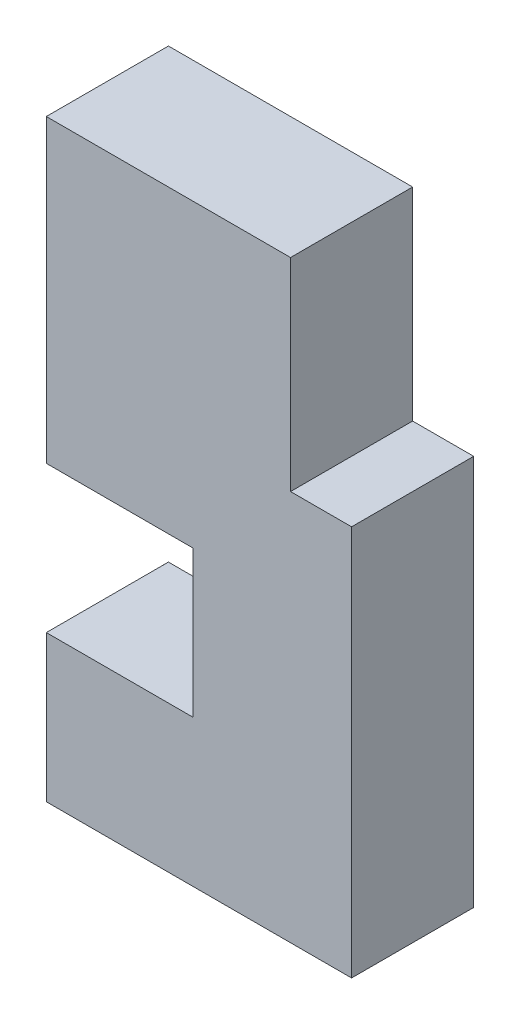
ISO-10303-21;
HEADER;
FILE_DESCRIPTION(('STEP AP214'),'2;1');
FILE_NAME('part.step','',(''),(''),'','','');
FILE_SCHEMA(('AUTOMOTIVE_DESIGN { 1 0 10303 214 1 1 1 1 }'));
ENDSEC;
DATA;
#1=APPLICATION_CONTEXT('core data for automotive mechanical design processes');
#2=APPLICATION_PROTOCOL_DEFINITION('international standard','automotive_design',2000,#1);
#3=PRODUCT_CONTEXT('',#1,'mechanical');
#4=PRODUCT('Part','Part','',(#3));
#5=PRODUCT_RELATED_PRODUCT_CATEGORY('part','',(#4));
#6=PRODUCT_DEFINITION_FORMATION('','',#4);
#7=PRODUCT_DEFINITION_CONTEXT('part definition',#1,'design');
#8=PRODUCT_DEFINITION('design','',#6,#7);
#9=PRODUCT_DEFINITION_SHAPE('','',#8);
#10=(LENGTH_UNIT() NAMED_UNIT(*) SI_UNIT(.MILLI.,.METRE.));
#11=(NAMED_UNIT(*) PLANE_ANGLE_UNIT() SI_UNIT($,.RADIAN.));
#12=(NAMED_UNIT(*) SI_UNIT($,.STERADIAN.) SOLID_ANGLE_UNIT());
#13=UNCERTAINTY_MEASURE_WITH_UNIT(LENGTH_MEASURE(1.E-05),#10,'distance_accuracy_value','');
#14=(GEOMETRIC_REPRESENTATION_CONTEXT(3) GLOBAL_UNCERTAINTY_ASSIGNED_CONTEXT((#13)) GLOBAL_UNIT_ASSIGNED_CONTEXT((#10,
#11,#12)) REPRESENTATION_CONTEXT('',''));
#15=CARTESIAN_POINT('',(0.,0.,0.));
#16=DIRECTION('',(0.,0.,1.));
#17=DIRECTION('',(1.,0.,0.));
#18=AXIS2_PLACEMENT_3D('',#15,#16,#17);
#19=CARTESIAN_POINT('',(-0.00029960835417188,20.4586796564352,-0.01));
#20=DIRECTION('',(0.,-1.,0.));
#21=DIRECTION('',(0.,0.,-1.));
#22=AXIS2_PLACEMENT_3D('',#19,#20,#21);
#23=PLANE('',#22);
#24=DIRECTION('',(1.,0.,0.));
#25=VECTOR('',#24,1.);
#26=CARTESIAN_POINT('',(0.,20.4586796564352,0.5));
#27=LINE('',#26,#25);
#28=CARTESIAN_POINT('',(-0.000299608354148308,20.4586796564352,0.5));
#29=VERTEX_POINT('',#28);
#30=CARTESIAN_POINT('',(0.999700391645836,20.4586796564352,0.5));
#31=VERTEX_POINT('',#30);
#32=EDGE_CURVE('E11',#29,#31,#27,.T.);
#33=ORIENTED_EDGE('',*,*,#32,.T.);
#34=DIRECTION('',(0.,0.,1.));
#35=VECTOR('',#34,1.);
#36=CARTESIAN_POINT('',(0.999700391645836,20.4586796564352,0.5));
#37=LINE('',#36,#35);
#38=CARTESIAN_POINT('',(0.999700391645836,20.4586796564352,0.));
#39=VERTEX_POINT('',#38);
#40=EDGE_CURVE('E24',#39,#31,#37,.T.);
#41=ORIENTED_EDGE('',*,*,#40,.F.);
#42=DIRECTION('',(1.,0.,0.));
#43=VECTOR('',#42,1.);
#44=CARTESIAN_POINT('',(0.,20.4586796564352,0.));
#45=LINE('',#44,#43);
#46=CARTESIAN_POINT('',(-0.000299608354148308,20.4586796564352,0.));
#47=VERTEX_POINT('',#46);
#48=EDGE_CURVE('E159',#47,#39,#45,.T.);
#49=ORIENTED_EDGE('',*,*,#48,.F.);
#50=DIRECTION('',(0.,0.,1.));
#51=VECTOR('',#50,1.);
#52=CARTESIAN_POINT('',(-0.000299608354148308,20.4586796564352,0.5));
#53=LINE('',#52,#51);
#54=EDGE_CURVE('E157',#47,#29,#53,.T.);
#55=ORIENTED_EDGE('',*,*,#54,.T.);
#56=EDGE_LOOP('',(#33,#41,#49,#55));
#57=FACE_BOUND('',#56,.T.);
#58=ADVANCED_FACE('F17',(#57),#23,.F.);
#59=CARTESIAN_POINT('',(0.999700391645848,0.,0.5));
#60=DIRECTION('',(-1.,0.,0.));
#61=DIRECTION('',(0.,-1.,0.));
#62=AXIS2_PLACEMENT_3D('',#59,#60,#61);
#63=PLANE('',#62);
#64=DIRECTION('',(0.,1.,0.));
#65=VECTOR('',#64,1.);
#66=CARTESIAN_POINT('',(0.999700391645848,0.,0.));
#67=LINE('',#66,#65);
#68=CARTESIAN_POINT('',(0.999700391645837,19.6286796574368,0.));
#69=VERTEX_POINT('',#68);
#70=EDGE_CURVE('E154',#69,#39,#67,.T.);
#71=ORIENTED_EDGE('',*,*,#70,.T.);
#72=ORIENTED_EDGE('',*,*,#40,.T.);
#73=DIRECTION('',(0.,1.,0.));
#74=VECTOR('',#73,1.);
#75=CARTESIAN_POINT('',(0.999700391645848,0.,0.5));
#76=LINE('',#75,#74);
#77=CARTESIAN_POINT('',(0.999700391645837,19.6286796574368,0.5));
#78=VERTEX_POINT('',#77);
#79=EDGE_CURVE('E152',#78,#31,#76,.T.);
#80=ORIENTED_EDGE('',*,*,#79,.F.);
#81=DIRECTION('',(0.,0.,-1.));
#82=VECTOR('',#81,1.);
#83=CARTESIAN_POINT('',(0.999700391645837,19.6286796574368,0.5));
#84=LINE('',#83,#82);
#85=EDGE_CURVE('E106',#78,#69,#84,.T.);
#86=ORIENTED_EDGE('',*,*,#85,.T.);
#87=EDGE_LOOP('',(#71,#72,#80,#86));
#88=FACE_BOUND('',#87,.T.);
#89=ADVANCED_FACE('F162',(#88),#63,.F.);
#90=CARTESIAN_POINT('',(0.,0.,0.));
#91=DIRECTION('',(0.,0.,1.));
#92=DIRECTION('',(1.,0.,0.));
#93=AXIS2_PLACEMENT_3D('',#90,#91,#92);
#94=PLANE('',#93);
#95=DIRECTION('',(0.,1.,0.));
#96=VECTOR('',#95,1.);
#97=CARTESIAN_POINT('',(-0.000299608354599036,0.,0.));
#98=LINE('',#97,#96);
#99=CARTESIAN_POINT('',(-0.000299608354175406,19.2286796574368,0.));
#100=VERTEX_POINT('',#99);
#101=EDGE_CURVE('E148',#100,#47,#98,.T.);
#102=ORIENTED_EDGE('',*,*,#101,.T.);
#103=ORIENTED_EDGE('',*,*,#48,.T.);
#104=ORIENTED_EDGE('',*,*,#70,.F.);
#105=DIRECTION('',(1.,0.,0.));
#106=VECTOR('',#105,1.);
#107=CARTESIAN_POINT('',(0.,19.6286796574368,0.));
#108=LINE('',#107,#106);
#109=CARTESIAN_POINT('',(1.2497003916458,19.6286796574368,0.));
#110=VERTEX_POINT('',#109);
#111=EDGE_CURVE('E146',#69,#110,#108,.T.);
#112=ORIENTED_EDGE('',*,*,#111,.T.);
#113=DIRECTION('',(0.,-1.,0.));
#114=VECTOR('',#113,1.);
#115=CARTESIAN_POINT('',(1.2497003916458,0.,0.));
#116=LINE('',#115,#114);
#117=CARTESIAN_POINT('',(1.2497003916458,18.0286796574368,0.));
#118=VERTEX_POINT('',#117);
#119=EDGE_CURVE('E110',#110,#118,#116,.T.);
#120=ORIENTED_EDGE('',*,*,#119,.T.);
#121=DIRECTION('',(-1.,0.,0.));
#122=VECTOR('',#121,1.);
#123=CARTESIAN_POINT('',(0.,18.0286796574368,0.));
#124=LINE('',#123,#122);
#125=CARTESIAN_POINT('',(-0.000299608354164182,18.0286796574368,0.));
#126=VERTEX_POINT('',#125);
#127=EDGE_CURVE('E143',#118,#126,#124,.T.);
#128=ORIENTED_EDGE('',*,*,#127,.T.);
#129=DIRECTION('',(0.,1.,0.));
#130=VECTOR('',#129,1.);
#131=CARTESIAN_POINT('',(-0.000299608353834302,0.,0.));
#132=LINE('',#131,#130);
#133=CARTESIAN_POINT('',(-0.000299608354175161,18.6286796574368,0.));
#134=VERTEX_POINT('',#133);
#135=EDGE_CURVE('E141',#126,#134,#132,.T.);
#136=ORIENTED_EDGE('',*,*,#135,.T.);
#137=DIRECTION('',(1.,0.,0.));
#138=VECTOR('',#137,1.);
#139=CARTESIAN_POINT('',(-1.07718693094024E-13,18.6286796574368,0.));
#140=LINE('',#139,#138);
#141=CARTESIAN_POINT('',(0.599700391645825,18.6286796574368,0.));
#142=VERTEX_POINT('',#141);
#143=EDGE_CURVE('E139',#134,#142,#140,.T.);
#144=ORIENTED_EDGE('',*,*,#143,.T.);
#145=DIRECTION('',(0.,1.,0.));
#146=VECTOR('',#145,1.);
#147=CARTESIAN_POINT('',(0.599700391645825,0.,0.));
#148=LINE('',#147,#146);
#149=CARTESIAN_POINT('',(0.599700391645825,19.2286796574368,0.));
#150=VERTEX_POINT('',#149);
#151=EDGE_CURVE('E137',#142,#150,#148,.T.);
#152=ORIENTED_EDGE('',*,*,#151,.T.);
#153=DIRECTION('',(-1.,0.,0.));
#154=VECTOR('',#153,1.);
#155=CARTESIAN_POINT('',(0.,19.2286796574368,0.));
#156=LINE('',#155,#154);
#157=EDGE_CURVE('E134',#150,#100,#156,.T.);
#158=ORIENTED_EDGE('',*,*,#157,.T.);
#159=EDGE_LOOP('',(#102,#103,#104,#112,#120,#128,#136,#144,#152,#158));
#160=FACE_BOUND('',#159,.T.);
#161=ADVANCED_FACE('F165',(#160),#94,.F.);
#162=CARTESIAN_POINT('',(0.,0.,0.5));
#163=DIRECTION('',(0.,0.,1.));
#164=DIRECTION('',(1.,0.,0.));
#165=AXIS2_PLACEMENT_3D('',#162,#163,#164);
#166=PLANE('',#165);
#167=ORIENTED_EDGE('',*,*,#32,.F.);
#168=DIRECTION('',(0.,1.,0.));
#169=VECTOR('',#168,1.);
#170=CARTESIAN_POINT('',(-0.000299608354599036,0.,0.5));
#171=LINE('',#170,#169);
#172=CARTESIAN_POINT('',(-0.000299608354175406,19.2286796574368,0.5));
#173=VERTEX_POINT('',#172);
#174=EDGE_CURVE('E131',#173,#29,#171,.T.);
#175=ORIENTED_EDGE('',*,*,#174,.F.);
#176=DIRECTION('',(-1.,0.,0.));
#177=VECTOR('',#176,1.);
#178=CARTESIAN_POINT('',(0.,19.2286796574368,0.5));
#179=LINE('',#178,#177);
#180=CARTESIAN_POINT('',(0.599700391645825,19.2286796574368,0.5));
#181=VERTEX_POINT('',#180);
#182=EDGE_CURVE('E128',#181,#173,#179,.T.);
#183=ORIENTED_EDGE('',*,*,#182,.F.);
#184=DIRECTION('',(0.,1.,0.));
#185=VECTOR('',#184,1.);
#186=CARTESIAN_POINT('',(0.599700391645825,0.,0.5));
#187=LINE('',#186,#185);
#188=CARTESIAN_POINT('',(0.599700391645825,18.6286796574368,0.5));
#189=VERTEX_POINT('',#188);
#190=EDGE_CURVE('E125',#189,#181,#187,.T.);
#191=ORIENTED_EDGE('',*,*,#190,.F.);
#192=DIRECTION('',(1.,0.,0.));
#193=VECTOR('',#192,1.);
#194=CARTESIAN_POINT('',(-1.07718693094024E-13,18.6286796574368,0.5));
#195=LINE('',#194,#193);
#196=CARTESIAN_POINT('',(-0.000299608354175161,18.6286796574368,0.5));
#197=VERTEX_POINT('',#196);
#198=EDGE_CURVE('E122',#197,#189,#195,.T.);
#199=ORIENTED_EDGE('',*,*,#198,.F.);
#200=DIRECTION('',(0.,1.,0.));
#201=VECTOR('',#200,1.);
#202=CARTESIAN_POINT('',(-0.000299608353834302,0.,0.5));
#203=LINE('',#202,#201);
#204=CARTESIAN_POINT('',(-0.000299608354164182,18.0286796574368,0.5));
#205=VERTEX_POINT('',#204);
#206=EDGE_CURVE('E119',#205,#197,#203,.T.);
#207=ORIENTED_EDGE('',*,*,#206,.F.);
#208=DIRECTION('',(-1.,0.,0.));
#209=VECTOR('',#208,1.);
#210=CARTESIAN_POINT('',(0.,18.0286796574368,0.5));
#211=LINE('',#210,#209);
#212=CARTESIAN_POINT('',(1.2497003916458,18.0286796574368,0.5));
#213=VERTEX_POINT('',#212);
#214=EDGE_CURVE('E93',#213,#205,#211,.T.);
#215=ORIENTED_EDGE('',*,*,#214,.F.);
#216=DIRECTION('',(0.,-1.,0.));
#217=VECTOR('',#216,1.);
#218=CARTESIAN_POINT('',(1.2497003916458,0.,0.5));
#219=LINE('',#218,#217);
#220=CARTESIAN_POINT('',(1.2497003916458,19.6286796574368,0.5));
#221=VERTEX_POINT('',#220);
#222=EDGE_CURVE('E88',#221,#213,#219,.T.);
#223=ORIENTED_EDGE('',*,*,#222,.F.);
#224=DIRECTION('',(1.,0.,0.));
#225=VECTOR('',#224,1.);
#226=CARTESIAN_POINT('',(0.,19.6286796574368,0.5));
#227=LINE('',#226,#225);
#228=EDGE_CURVE('E91',#78,#221,#227,.T.);
#229=ORIENTED_EDGE('',*,*,#228,.F.);
#230=ORIENTED_EDGE('',*,*,#79,.T.);
#231=EDGE_LOOP('',(#167,#175,#183,#191,#199,#207,#215,#223,#229,#230));
#232=FACE_BOUND('',#231,.T.);
#233=ADVANCED_FACE('F90',(#232),#166,.T.);
#234=CARTESIAN_POINT('',(0.,19.6286796574368,0.5));
#235=DIRECTION('',(0.,1.,0.));
#236=DIRECTION('',(0.,0.,1.));
#237=AXIS2_PLACEMENT_3D('',#234,#235,#236);
#238=PLANE('',#237);
#239=ORIENTED_EDGE('',*,*,#111,.F.);
#240=ORIENTED_EDGE('',*,*,#85,.F.);
#241=ORIENTED_EDGE('',*,*,#228,.T.);
#242=DIRECTION('',(0.,0.,-1.));
#243=VECTOR('',#242,1.);
#244=CARTESIAN_POINT('',(1.2497003916458,19.6286796574368,0.5));
#245=LINE('',#244,#243);
#246=EDGE_CURVE('E104',#221,#110,#245,.T.);
#247=ORIENTED_EDGE('',*,*,#246,.T.);
#248=EDGE_LOOP('',(#239,#240,#241,#247));
#249=FACE_BOUND('',#248,.T.);
#250=ADVANCED_FACE('F103',(#249),#238,.T.);
#251=CARTESIAN_POINT('',(-0.000299608354599036,0.,0.5));
#252=DIRECTION('',(-1.,0.,0.));
#253=DIRECTION('',(0.,-1.,0.));
#254=AXIS2_PLACEMENT_3D('',#251,#252,#253);
#255=PLANE('',#254);
#256=ORIENTED_EDGE('',*,*,#54,.F.);
#257=ORIENTED_EDGE('',*,*,#101,.F.);
#258=DIRECTION('',(0.,0.,-1.));
#259=VECTOR('',#258,1.);
#260=CARTESIAN_POINT('',(-0.000299608354175406,19.2286796574368,0.5));
#261=LINE('',#260,#259);
#262=EDGE_CURVE('E111',#173,#100,#261,.T.);
#263=ORIENTED_EDGE('',*,*,#262,.F.);
#264=ORIENTED_EDGE('',*,*,#174,.T.);
#265=EDGE_LOOP('',(#256,#257,#263,#264));
#266=FACE_BOUND('',#265,.T.);
#267=ADVANCED_FACE('F169',(#266),#255,.T.);
#268=CARTESIAN_POINT('',(1.2497003916458,0.,0.5));
#269=DIRECTION('',(1.,0.,0.));
#270=DIRECTION('',(0.,1.,0.));
#271=AXIS2_PLACEMENT_3D('',#268,#269,#270);
#272=PLANE('',#271);
#273=ORIENTED_EDGE('',*,*,#119,.F.);
#274=ORIENTED_EDGE('',*,*,#246,.F.);
#275=ORIENTED_EDGE('',*,*,#222,.T.);
#276=DIRECTION('',(0.,0.,-1.));
#277=VECTOR('',#276,1.);
#278=CARTESIAN_POINT('',(1.2497003916458,18.0286796574368,0.5));
#279=LINE('',#278,#277);
#280=EDGE_CURVE('E114',#213,#118,#279,.T.);
#281=ORIENTED_EDGE('',*,*,#280,.T.);
#282=EDGE_LOOP('',(#273,#274,#275,#281));
#283=FACE_BOUND('',#282,.T.);
#284=ADVANCED_FACE('F109',(#283),#272,.T.);
#285=CARTESIAN_POINT('',(0.,18.0286796574368,0.5));
#286=DIRECTION('',(0.,-1.,0.));
#287=DIRECTION('',(0.,0.,-1.));
#288=AXIS2_PLACEMENT_3D('',#285,#286,#287);
#289=PLANE('',#288);
#290=ORIENTED_EDGE('',*,*,#127,.F.);
#291=ORIENTED_EDGE('',*,*,#280,.F.);
#292=ORIENTED_EDGE('',*,*,#214,.T.);
#293=DIRECTION('',(0.,0.,-1.));
#294=VECTOR('',#293,1.);
#295=CARTESIAN_POINT('',(-0.000299608354164182,18.0286796574368,0.5));
#296=LINE('',#295,#294);
#297=EDGE_CURVE('E185',#205,#126,#296,.T.);
#298=ORIENTED_EDGE('',*,*,#297,.T.);
#299=EDGE_LOOP('',(#290,#291,#292,#298));
#300=FACE_BOUND('',#299,.T.);
#301=ADVANCED_FACE('F189',(#300),#289,.T.);
#302=CARTESIAN_POINT('',(-0.000299608353834302,0.,0.5));
#303=DIRECTION('',(-1.,0.,0.));
#304=DIRECTION('',(0.,-1.,0.));
#305=AXIS2_PLACEMENT_3D('',#302,#303,#304);
#306=PLANE('',#305);
#307=ORIENTED_EDGE('',*,*,#135,.F.);
#308=ORIENTED_EDGE('',*,*,#297,.F.);
#309=ORIENTED_EDGE('',*,*,#206,.T.);
#310=DIRECTION('',(0.,0.,-1.));
#311=VECTOR('',#310,1.);
#312=CARTESIAN_POINT('',(-0.000299608354175161,18.6286796574368,0.5));
#313=LINE('',#312,#311);
#314=EDGE_CURVE('E180',#197,#134,#313,.T.);
#315=ORIENTED_EDGE('',*,*,#314,.T.);
#316=EDGE_LOOP('',(#307,#308,#309,#315));
#317=FACE_BOUND('',#316,.T.);
#318=ADVANCED_FACE('F194',(#317),#306,.T.);
#319=CARTESIAN_POINT('',(-1.07718693094024E-13,18.6286796574368,0.5));
#320=DIRECTION('',(0.,1.,0.));
#321=DIRECTION('',(-1.,0.,0.));
#322=AXIS2_PLACEMENT_3D('',#319,#320,#321);
#323=PLANE('',#322);
#324=ORIENTED_EDGE('',*,*,#143,.F.);
#325=ORIENTED_EDGE('',*,*,#314,.F.);
#326=ORIENTED_EDGE('',*,*,#198,.T.);
#327=DIRECTION('',(0.,0.,-1.));
#328=VECTOR('',#327,1.);
#329=CARTESIAN_POINT('',(0.599700391645825,18.6286796574368,0.5));
#330=LINE('',#329,#328);
#331=EDGE_CURVE('E177',#189,#142,#330,.T.);
#332=ORIENTED_EDGE('',*,*,#331,.T.);
#333=EDGE_LOOP('',(#324,#325,#326,#332));
#334=FACE_BOUND('',#333,.T.);
#335=ADVANCED_FACE('F197',(#334),#323,.T.);
#336=CARTESIAN_POINT('',(0.599700391645825,0.,0.5));
#337=DIRECTION('',(-1.,0.,0.));
#338=DIRECTION('',(0.,0.,1.));
#339=AXIS2_PLACEMENT_3D('',#336,#337,#338);
#340=PLANE('',#339);
#341=ORIENTED_EDGE('',*,*,#151,.F.);
#342=ORIENTED_EDGE('',*,*,#331,.F.);
#343=ORIENTED_EDGE('',*,*,#190,.T.);
#344=DIRECTION('',(0.,0.,-1.));
#345=VECTOR('',#344,1.);
#346=CARTESIAN_POINT('',(0.599700391645825,19.2286796574368,0.5));
#347=LINE('',#346,#345);
#348=EDGE_CURVE('E174',#181,#150,#347,.T.);
#349=ORIENTED_EDGE('',*,*,#348,.T.);
#350=EDGE_LOOP('',(#341,#342,#343,#349));
#351=FACE_BOUND('',#350,.T.);
#352=ADVANCED_FACE('F199',(#351),#340,.T.);
#353=CARTESIAN_POINT('',(0.,19.2286796574368,0.5));
#354=DIRECTION('',(0.,-1.,0.));
#355=DIRECTION('',(0.,0.,-1.));
#356=AXIS2_PLACEMENT_3D('',#353,#354,#355);
#357=PLANE('',#356);
#358=ORIENTED_EDGE('',*,*,#157,.F.);
#359=ORIENTED_EDGE('',*,*,#348,.F.);
#360=ORIENTED_EDGE('',*,*,#182,.T.);
#361=ORIENTED_EDGE('',*,*,#262,.T.);
#362=EDGE_LOOP('',(#358,#359,#360,#361));
#363=FACE_BOUND('',#362,.T.);
#364=ADVANCED_FACE('F172',(#363),#357,.T.);
#365=CLOSED_SHELL('',(#58,#89,#161,#233,#250,#267,#284,#301,#318,#335,#352,#364));
#366=MANIFOLD_SOLID_BREP('B1',#365);
#367=ADVANCED_BREP_SHAPE_REPRESENTATION('',(#18,#366),#14);
#368=SHAPE_DEFINITION_REPRESENTATION(#9,#367);
ENDSEC;
END-ISO-10303-21;
